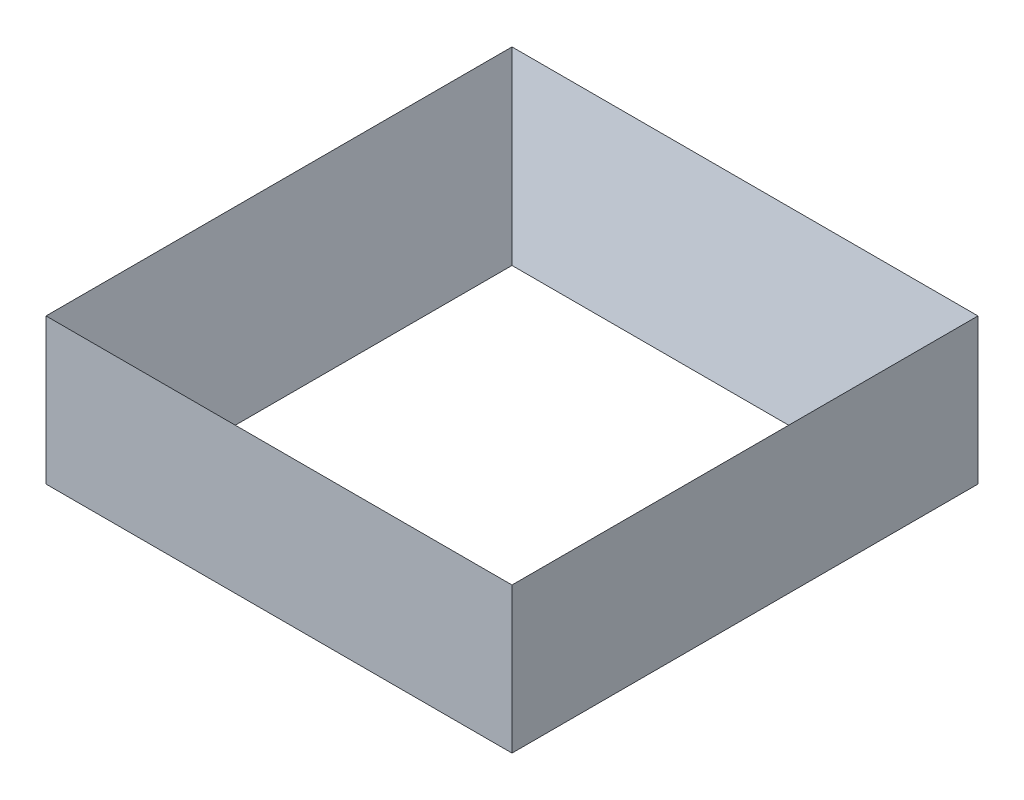
ISO-10303-21;
HEADER;
FILE_DESCRIPTION(('STEP AP214'),'2;1');
FILE_NAME('part.step','',(''),(''),'','','');
FILE_SCHEMA(('AUTOMOTIVE_DESIGN { 1 0 10303 214 1 1 1 1 }'));
ENDSEC;
DATA;
#1=APPLICATION_CONTEXT('core data for automotive mechanical design processes');
#2=APPLICATION_PROTOCOL_DEFINITION('international standard','automotive_design',2000,#1);
#3=PRODUCT_CONTEXT('',#1,'mechanical');
#4=PRODUCT('Part','Part','',(#3));
#5=PRODUCT_RELATED_PRODUCT_CATEGORY('part','',(#4));
#6=PRODUCT_DEFINITION_FORMATION('','',#4);
#7=PRODUCT_DEFINITION_CONTEXT('part definition',#1,'design');
#8=PRODUCT_DEFINITION('design','',#6,#7);
#9=PRODUCT_DEFINITION_SHAPE('','',#8);
#10=(LENGTH_UNIT() NAMED_UNIT(*) SI_UNIT(.MILLI.,.METRE.));
#11=(NAMED_UNIT(*) PLANE_ANGLE_UNIT() SI_UNIT($,.RADIAN.));
#12=(NAMED_UNIT(*) SI_UNIT($,.STERADIAN.) SOLID_ANGLE_UNIT());
#13=UNCERTAINTY_MEASURE_WITH_UNIT(LENGTH_MEASURE(1.E-05),#10,'distance_accuracy_value','');
#14=(GEOMETRIC_REPRESENTATION_CONTEXT(3) GLOBAL_UNCERTAINTY_ASSIGNED_CONTEXT((#13)) GLOBAL_UNIT_ASSIGNED_CONTEXT((#10,
#11,#12)) REPRESENTATION_CONTEXT('',''));
#15=CARTESIAN_POINT('',(0.,0.,0.));
#16=DIRECTION('',(0.,0.,1.));
#17=DIRECTION('',(1.,0.,0.));
#18=AXIS2_PLACEMENT_3D('',#15,#16,#17);
#19=CARTESIAN_POINT('',(0.,0.,0.));
#20=DIRECTION('',(0.,-1.,0.));
#21=DIRECTION('',(0.,0.,-1.));
#22=AXIS2_PLACEMENT_3D('',#19,#20,#21);
#23=PLANE('',#22);
#24=DIRECTION('',(0.,0.,1.));
#25=VECTOR('',#24,1.);
#26=CARTESIAN_POINT('',(0.,0.,0.));
#27=LINE('',#26,#25);
#28=CARTESIAN_POINT('',(0.,0.,-64.));
#29=VERTEX_POINT('',#28);
#30=CARTESIAN_POINT('',(0.,0.,0.));
#31=VERTEX_POINT('',#30);
#32=EDGE_CURVE('E110',#29,#31,#27,.T.);
#33=ORIENTED_EDGE('',*,*,#32,.F.);
#34=DIRECTION('',(-1.,0.,0.));
#35=VECTOR('',#34,1.);
#36=CARTESIAN_POINT('',(0.,0.,-64.));
#37=LINE('',#36,#35);
#38=CARTESIAN_POINT('',(64.,0.,-64.));
#39=VERTEX_POINT('',#38);
#40=EDGE_CURVE('E97',#39,#29,#37,.T.);
#41=ORIENTED_EDGE('',*,*,#40,.F.);
#42=DIRECTION('',(0.,0.,-1.));
#43=VECTOR('',#42,1.);
#44=CARTESIAN_POINT('',(64.,0.,0.));
#45=LINE('',#44,#43);
#46=CARTESIAN_POINT('',(64.,0.,0.));
#47=VERTEX_POINT('',#46);
#48=EDGE_CURVE('E89',#47,#39,#45,.T.);
#49=ORIENTED_EDGE('',*,*,#48,.F.);
#50=DIRECTION('',(1.,0.,0.));
#51=VECTOR('',#50,1.);
#52=CARTESIAN_POINT('',(0.,0.,0.));
#53=LINE('',#52,#51);
#54=EDGE_CURVE('E98',#31,#47,#53,.T.);
#55=ORIENTED_EDGE('',*,*,#54,.F.);
#56=EDGE_LOOP('',(#33,#41,#49,#55));
#57=FACE_BOUND('',#56,.T.);
#58=DIRECTION('',(-1.,0.,0.));
#59=VECTOR('',#58,1.);
#60=CARTESIAN_POINT('',(6.,0.,-6.));
#61=LINE('',#60,#59);
#62=CARTESIAN_POINT('',(58.,0.,-6.));
#63=VERTEX_POINT('',#62);
#64=CARTESIAN_POINT('',(6.,0.,-6.));
#65=VERTEX_POINT('',#64);
#66=EDGE_CURVE('E186',#63,#65,#61,.T.);
#67=ORIENTED_EDGE('',*,*,#66,.F.);
#68=DIRECTION('',(0.,0.,1.));
#69=VECTOR('',#68,1.);
#70=CARTESIAN_POINT('',(58.,0.,-6.));
#71=LINE('',#70,#69);
#72=CARTESIAN_POINT('',(58.,0.,-58.));
#73=VERTEX_POINT('',#72);
#74=EDGE_CURVE('E183',#73,#63,#71,.T.);
#75=ORIENTED_EDGE('',*,*,#74,.F.);
#76=DIRECTION('',(1.,0.,0.));
#77=VECTOR('',#76,1.);
#78=CARTESIAN_POINT('',(6.,0.,-58.));
#79=LINE('',#78,#77);
#80=CARTESIAN_POINT('',(6.,0.,-58.));
#81=VERTEX_POINT('',#80);
#82=EDGE_CURVE('E178',#81,#73,#79,.T.);
#83=ORIENTED_EDGE('',*,*,#82,.F.);
#84=DIRECTION('',(0.,0.,-1.));
#85=VECTOR('',#84,1.);
#86=CARTESIAN_POINT('',(6.,0.,-6.));
#87=LINE('',#86,#85);
#88=EDGE_CURVE('E171',#65,#81,#87,.T.);
#89=ORIENTED_EDGE('',*,*,#88,.F.);
#90=EDGE_LOOP('',(#67,#75,#83,#89));
#91=FACE_BOUND('',#90,.T.);
#92=ADVANCED_FACE('F42',(#57,#91),#23,.T.);
#93=CARTESIAN_POINT('',(0.,20.,0.));
#94=DIRECTION('',(1.,0.,0.));
#95=DIRECTION('',(0.,0.,-1.));
#96=AXIS2_PLACEMENT_3D('',#93,#94,#95);
#97=PLANE('',#96);
#98=ORIENTED_EDGE('',*,*,#32,.T.);
#99=DIRECTION('',(0.,-1.,0.));
#100=VECTOR('',#99,1.);
#101=CARTESIAN_POINT('',(0.,20.,0.));
#102=LINE('',#101,#100);
#103=CARTESIAN_POINT('',(0.,20.,0.));
#104=VERTEX_POINT('',#103);
#105=EDGE_CURVE('E12',#104,#31,#102,.T.);
#106=ORIENTED_EDGE('',*,*,#105,.F.);
#107=CARTESIAN_POINT('',(0.,20.,-64.));
#108=DIRECTION('',(0.,0.,1.));
#109=VECTOR('',#108,1.);
#110=LINE('',#107,#109);
#111=CARTESIAN_POINT('',(0.,20.,-64.));
#112=VERTEX_POINT('',#111);
#113=EDGE_CURVE('E111',#112,#104,#110,.T.);
#114=ORIENTED_EDGE('',*,*,#113,.F.);
#115=DIRECTION('',(0.,-1.,0.));
#116=VECTOR('',#115,1.);
#117=CARTESIAN_POINT('',(0.,20.,-64.));
#118=LINE('',#117,#116);
#119=EDGE_CURVE('E105',#112,#29,#118,.T.);
#120=ORIENTED_EDGE('',*,*,#119,.T.);
#121=EDGE_LOOP('',(#98,#106,#114,#120));
#122=FACE_BOUND('',#121,.T.);
#123=ADVANCED_FACE('F44',(#122),#97,.F.);
#124=CARTESIAN_POINT('',(0.,20.,0.));
#125=DIRECTION('',(0.,0.,-1.));
#126=DIRECTION('',(-1.,0.,0.));
#127=AXIS2_PLACEMENT_3D('',#124,#125,#126);
#128=PLANE('',#127);
#129=ORIENTED_EDGE('',*,*,#54,.T.);
#130=DIRECTION('',(0.,-1.,0.));
#131=VECTOR('',#130,1.);
#132=CARTESIAN_POINT('',(64.,20.,0.));
#133=LINE('',#132,#131);
#134=CARTESIAN_POINT('',(64.,20.,0.));
#135=VERTEX_POINT('',#134);
#136=EDGE_CURVE('E52',#135,#47,#133,.T.);
#137=ORIENTED_EDGE('',*,*,#136,.F.);
#138=CARTESIAN_POINT('',(0.,20.,0.));
#139=DIRECTION('',(1.,0.,0.));
#140=VECTOR('',#139,1.);
#141=LINE('',#138,#140);
#142=EDGE_CURVE('E113',#104,#135,#141,.T.);
#143=ORIENTED_EDGE('',*,*,#142,.F.);
#144=ORIENTED_EDGE('',*,*,#105,.T.);
#145=EDGE_LOOP('',(#129,#137,#143,#144));
#146=FACE_BOUND('',#145,.T.);
#147=ADVANCED_FACE('F142',(#146),#128,.F.);
#148=CARTESIAN_POINT('',(64.,20.,0.));
#149=DIRECTION('',(-1.,0.,0.));
#150=DIRECTION('',(0.,0.,1.));
#151=AXIS2_PLACEMENT_3D('',#148,#149,#150);
#152=PLANE('',#151);
#153=ORIENTED_EDGE('',*,*,#48,.T.);
#154=DIRECTION('',(0.,-1.,0.));
#155=VECTOR('',#154,1.);
#156=CARTESIAN_POINT('',(64.,20.,-64.));
#157=LINE('',#156,#155);
#158=CARTESIAN_POINT('',(64.,20.,-64.));
#159=VERTEX_POINT('',#158);
#160=EDGE_CURVE('E93',#159,#39,#157,.T.);
#161=ORIENTED_EDGE('',*,*,#160,.F.);
#162=CARTESIAN_POINT('',(64.,20.,0.));
#163=DIRECTION('',(0.,0.,-1.));
#164=VECTOR('',#163,1.);
#165=LINE('',#162,#164);
#166=EDGE_CURVE('E224',#135,#159,#165,.T.);
#167=ORIENTED_EDGE('',*,*,#166,.F.);
#168=ORIENTED_EDGE('',*,*,#136,.T.);
#169=EDGE_LOOP('',(#153,#161,#167,#168));
#170=FACE_BOUND('',#169,.T.);
#171=ADVANCED_FACE('F91',(#170),#152,.F.);
#172=CARTESIAN_POINT('',(0.,20.,-64.));
#173=DIRECTION('',(0.,0.,1.));
#174=DIRECTION('',(1.,0.,0.));
#175=AXIS2_PLACEMENT_3D('',#172,#173,#174);
#176=PLANE('',#175);
#177=ORIENTED_EDGE('',*,*,#40,.T.);
#178=ORIENTED_EDGE('',*,*,#119,.F.);
#179=CARTESIAN_POINT('',(64.,20.,-64.));
#180=DIRECTION('',(-1.,0.,0.));
#181=VECTOR('',#180,1.);
#182=LINE('',#179,#181);
#183=EDGE_CURVE('E69',#159,#112,#182,.T.);
#184=ORIENTED_EDGE('',*,*,#183,.F.);
#185=ORIENTED_EDGE('',*,*,#160,.T.);
#186=EDGE_LOOP('',(#177,#178,#184,#185));
#187=FACE_BOUND('',#186,.T.);
#188=ADVANCED_FACE('F101',(#187),#176,.F.);
#189=CARTESIAN_POINT('',(53.2110091743119,-15.9633027522936,0.));
#190=DIRECTION('',(-0.957826285221151,0.287347885566345,0.));
#191=DIRECTION('',(-0.287347885566345,-0.957826285221152,0.));
#192=AXIS2_PLACEMENT_3D('',#189,#190,#191);
#193=PLANE('',#192);
#194=DIRECTION('',(0.276172385369497,0.920574617898324,-0.276172385369497));
#195=VECTOR('',#194,1.);
#196=CARTESIAN_POINT('',(58.,0.,-58.));
#197=LINE('',#196,#195);
#198=EDGE_CURVE('E188',#73,#159,#197,.T.);
#199=ORIENTED_EDGE('',*,*,#198,.F.);
#200=ORIENTED_EDGE('',*,*,#74,.T.);
#201=DIRECTION('',(0.276172385369497,0.920574617898323,0.276172385369497));
#202=VECTOR('',#201,1.);
#203=CARTESIAN_POINT('',(58.,0.,-6.));
#204=LINE('',#203,#202);
#205=EDGE_CURVE('E201',#63,#135,#204,.T.);
#206=ORIENTED_EDGE('',*,*,#205,.T.);
#207=ORIENTED_EDGE('',*,*,#166,.T.);
#208=EDGE_LOOP('',(#199,#200,#206,#207));
#209=FACE_BOUND('',#208,.T.);
#210=ADVANCED_FACE('F197',(#209),#193,.T.);
#211=CARTESIAN_POINT('',(0.,1.65137614678899,-5.5045871559633));
#212=DIRECTION('',(0.,0.287347885566345,-0.957826285221151));
#213=DIRECTION('',(0.,0.957826285221152,0.287347885566345));
#214=AXIS2_PLACEMENT_3D('',#211,#212,#213);
#215=PLANE('',#214);
#216=ORIENTED_EDGE('',*,*,#205,.F.);
#217=ORIENTED_EDGE('',*,*,#66,.T.);
#218=DIRECTION('',(-0.276172385369497,0.920574617898323,0.276172385369497));
#219=VECTOR('',#218,1.);
#220=CARTESIAN_POINT('',(6.,0.,-6.));
#221=LINE('',#220,#219);
#222=EDGE_CURVE('E60',#65,#104,#221,.T.);
#223=ORIENTED_EDGE('',*,*,#222,.T.);
#224=ORIENTED_EDGE('',*,*,#142,.T.);
#225=EDGE_LOOP('',(#216,#217,#223,#224));
#226=FACE_BOUND('',#225,.T.);
#227=ADVANCED_FACE('F207',(#226),#215,.T.);
#228=CARTESIAN_POINT('',(0.,-15.9633027522936,-53.2110091743119));
#229=DIRECTION('',(0.,0.287347885566345,0.957826285221151));
#230=DIRECTION('',(0.,-0.957826285221152,0.287347885566345));
#231=AXIS2_PLACEMENT_3D('',#228,#229,#230);
#232=PLANE('',#231);
#233=DIRECTION('',(-0.276172385369497,0.920574617898324,-0.276172385369497));
#234=VECTOR('',#233,1.);
#235=CARTESIAN_POINT('',(6.,0.,-58.));
#236=LINE('',#235,#234);
#237=EDGE_CURVE('E209',#81,#112,#236,.T.);
#238=ORIENTED_EDGE('',*,*,#237,.F.);
#239=ORIENTED_EDGE('',*,*,#82,.T.);
#240=ORIENTED_EDGE('',*,*,#198,.T.);
#241=ORIENTED_EDGE('',*,*,#183,.T.);
#242=EDGE_LOOP('',(#238,#239,#240,#241));
#243=FACE_BOUND('',#242,.T.);
#244=ADVANCED_FACE('F240',(#243),#232,.T.);
#245=CARTESIAN_POINT('',(5.5045871559633,1.65137614678899,0.));
#246=DIRECTION('',(0.957826285221151,0.287347885566345,0.));
#247=DIRECTION('',(-0.287347885566345,0.957826285221152,0.));
#248=AXIS2_PLACEMENT_3D('',#245,#246,#247);
#249=PLANE('',#248);
#250=ORIENTED_EDGE('',*,*,#222,.F.);
#251=ORIENTED_EDGE('',*,*,#88,.T.);
#252=ORIENTED_EDGE('',*,*,#237,.T.);
#253=ORIENTED_EDGE('',*,*,#113,.T.);
#254=EDGE_LOOP('',(#250,#251,#252,#253));
#255=FACE_BOUND('',#254,.T.);
#256=ADVANCED_FACE('F259',(#255),#249,.T.);
#257=CLOSED_SHELL('',(#92,#123,#147,#171,#188,#210,#227,#244,#256));
#258=MANIFOLD_SOLID_BREP('B2',#257);
#259=ADVANCED_BREP_SHAPE_REPRESENTATION('',(#18,#258),#14);
#260=SHAPE_DEFINITION_REPRESENTATION(#9,#259);
ENDSEC;
END-ISO-10303-21;
